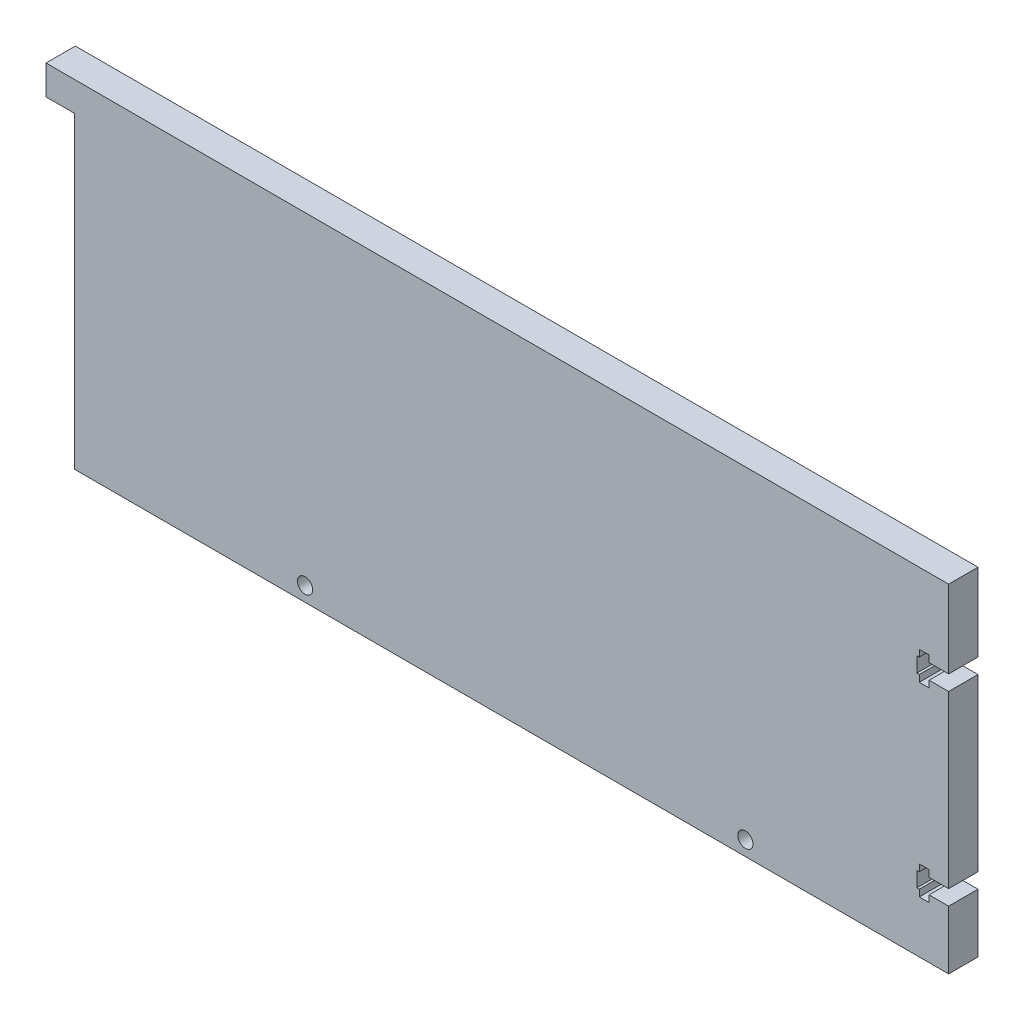
ISO-10303-21;
HEADER;
FILE_DESCRIPTION(('STEP AP214'),'2;1');
FILE_NAME('part.step','',(''),(''),'','','');
FILE_SCHEMA(('AUTOMOTIVE_DESIGN { 1 0 10303 214 1 1 1 1 }'));
ENDSEC;
DATA;
#1=APPLICATION_CONTEXT('core data for automotive mechanical design processes');
#2=APPLICATION_PROTOCOL_DEFINITION('international standard','automotive_design',2000,#1);
#3=PRODUCT_CONTEXT('',#1,'mechanical');
#4=PRODUCT('Part','Part','',(#3));
#5=PRODUCT_RELATED_PRODUCT_CATEGORY('part','',(#4));
#6=PRODUCT_DEFINITION_FORMATION('','',#4);
#7=PRODUCT_DEFINITION_CONTEXT('part definition',#1,'design');
#8=PRODUCT_DEFINITION('design','',#6,#7);
#9=PRODUCT_DEFINITION_SHAPE('','',#8);
#10=(LENGTH_UNIT() NAMED_UNIT(*) SI_UNIT(.MILLI.,.METRE.));
#11=(NAMED_UNIT(*) PLANE_ANGLE_UNIT() SI_UNIT($,.RADIAN.));
#12=(NAMED_UNIT(*) SI_UNIT($,.STERADIAN.) SOLID_ANGLE_UNIT());
#13=UNCERTAINTY_MEASURE_WITH_UNIT(LENGTH_MEASURE(1.E-05),#10,'distance_accuracy_value','');
#14=(GEOMETRIC_REPRESENTATION_CONTEXT(3) GLOBAL_UNCERTAINTY_ASSIGNED_CONTEXT((#13)) GLOBAL_UNIT_ASSIGNED_CONTEXT((#10,
#11,#12)) REPRESENTATION_CONTEXT('',''));
#15=CARTESIAN_POINT('',(0.,0.,0.));
#16=DIRECTION('',(0.,0.,1.));
#17=DIRECTION('',(1.,0.,0.));
#18=AXIS2_PLACEMENT_3D('',#15,#16,#17);
#19=CARTESIAN_POINT('',(172.7,107.594867693291,-6.));
#20=DIRECTION('',(1.,0.,0.));
#21=DIRECTION('',(0.,0.,-1.));
#22=AXIS2_PLACEMENT_3D('',#19,#20,#21);
#23=PLANE('',#22);
#24=DIRECTION('',(0.,0.,-1.));
#25=VECTOR('',#24,1.);
#26=CARTESIAN_POINT('',(172.7,88.5948676932912,0.));
#27=LINE('',#26,#25);
#28=CARTESIAN_POINT('',(172.7,88.5948676932912,0.));
#29=VERTEX_POINT('',#28);
#30=CARTESIAN_POINT('',(172.7,88.5948676932912,-6.));
#31=VERTEX_POINT('',#30);
#32=EDGE_CURVE('E314',#29,#31,#27,.T.);
#33=ORIENTED_EDGE('',*,*,#32,.F.);
#34=DIRECTION('',(0.,1.,0.));
#35=VECTOR('',#34,1.);
#36=CARTESIAN_POINT('',(172.7,107.594867693291,0.));
#37=LINE('',#36,#35);
#38=CARTESIAN_POINT('',(172.7,53.6948676932912,0.));
#39=VERTEX_POINT('',#38);
#40=EDGE_CURVE('E462',#39,#29,#37,.T.);
#41=ORIENTED_EDGE('',*,*,#40,.F.);
#42=DIRECTION('',(0.,0.,-1.));
#43=VECTOR('',#42,1.);
#44=CARTESIAN_POINT('',(172.7,53.6948676932912,0.));
#45=LINE('',#44,#43);
#46=CARTESIAN_POINT('',(172.7,53.6948676932912,-6.));
#47=VERTEX_POINT('',#46);
#48=EDGE_CURVE('E408',#39,#47,#45,.T.);
#49=ORIENTED_EDGE('',*,*,#48,.T.);
#50=DIRECTION('',(0.,1.,0.));
#51=VECTOR('',#50,1.);
#52=CARTESIAN_POINT('',(172.7,107.594867693291,-6.));
#53=LINE('',#52,#51);
#54=EDGE_CURVE('E451',#47,#31,#53,.T.);
#55=ORIENTED_EDGE('',*,*,#54,.T.);
#56=EDGE_LOOP('',(#33,#41,#49,#55));
#57=FACE_BOUND('',#56,.T.);
#58=ADVANCED_FACE('F34',(#57),#23,.T.);
#59=DIRECTION('',(0.,0.,-1.));
#60=VECTOR('',#59,1.);
#61=CARTESIAN_POINT('',(172.7,50.5948676932912,0.));
#62=LINE('',#61,#60);
#63=CARTESIAN_POINT('',(172.7,50.5948676932912,0.));
#64=VERTEX_POINT('',#63);
#65=CARTESIAN_POINT('',(172.7,50.5948676932912,-6.));
#66=VERTEX_POINT('',#65);
#67=EDGE_CURVE('E405',#64,#66,#62,.T.);
#68=ORIENTED_EDGE('',*,*,#67,.F.);
#69=CARTESIAN_POINT('',(172.7,38.5948676932912,0.));
#70=VERTEX_POINT('',#69);
#71=EDGE_CURVE('E242',#70,#64,#37,.T.);
#72=ORIENTED_EDGE('',*,*,#71,.F.);
#73=DIRECTION('',(0.,0.,1.));
#74=VECTOR('',#73,1.);
#75=CARTESIAN_POINT('',(172.7,38.5948676932912,-6.));
#76=LINE('',#75,#74);
#77=CARTESIAN_POINT('',(172.7,38.5948676932912,-6.));
#78=VERTEX_POINT('',#77);
#79=EDGE_CURVE('E43',#78,#70,#76,.T.);
#80=ORIENTED_EDGE('',*,*,#79,.F.);
#81=EDGE_CURVE('E447',#78,#66,#53,.T.);
#82=ORIENTED_EDGE('',*,*,#81,.T.);
#83=EDGE_LOOP('',(#68,#72,#80,#82));
#84=FACE_BOUND('',#83,.T.);
#85=ADVANCED_FACE('F478',(#84),#23,.T.);
#86=CARTESIAN_POINT('',(172.7,107.594867693291,-6.));
#87=DIRECTION('',(0.,1.,0.));
#88=DIRECTION('',(-1.,0.,0.));
#89=AXIS2_PLACEMENT_3D('',#86,#87,#88);
#90=PLANE('',#89);
#91=DIRECTION('',(-1.,0.,0.));
#92=VECTOR('',#91,1.);
#93=CARTESIAN_POINT('',(172.7,107.594867693291,0.));
#94=LINE('',#93,#92);
#95=CARTESIAN_POINT('',(172.7,107.594867693291,0.));
#96=VERTEX_POINT('',#95);
#97=CARTESIAN_POINT('',(-11.8,107.594867693291,0.));
#98=VERTEX_POINT('',#97);
#99=EDGE_CURVE('E439',#96,#98,#94,.T.);
#100=ORIENTED_EDGE('',*,*,#99,.F.);
#101=DIRECTION('',(0.,0.,1.));
#102=VECTOR('',#101,1.);
#103=CARTESIAN_POINT('',(172.7,107.594867693291,-6.));
#104=LINE('',#103,#102);
#105=CARTESIAN_POINT('',(172.7,107.594867693291,-6.));
#106=VERTEX_POINT('',#105);
#107=EDGE_CURVE('E11',#106,#96,#104,.T.);
#108=ORIENTED_EDGE('',*,*,#107,.F.);
#109=DIRECTION('',(-1.,0.,0.));
#110=VECTOR('',#109,1.);
#111=CARTESIAN_POINT('',(172.7,107.594867693291,-6.));
#112=LINE('',#111,#110);
#113=CARTESIAN_POINT('',(-11.8,107.594867693291,-6.));
#114=VERTEX_POINT('',#113);
#115=EDGE_CURVE('E234',#106,#114,#112,.T.);
#116=ORIENTED_EDGE('',*,*,#115,.T.);
#117=DIRECTION('',(0.,0.,-1.));
#118=VECTOR('',#117,1.);
#119=CARTESIAN_POINT('',(-11.8,107.594867693291,-6.));
#120=LINE('',#119,#118);
#121=EDGE_CURVE('E238',#98,#114,#120,.T.);
#122=ORIENTED_EDGE('',*,*,#121,.F.);
#123=EDGE_LOOP('',(#100,#108,#116,#122));
#124=FACE_BOUND('',#123,.T.);
#125=ADVANCED_FACE('F36',(#124),#90,.T.);
#126=DIRECTION('',(0.,0.,-1.));
#127=VECTOR('',#126,1.);
#128=CARTESIAN_POINT('',(172.7,91.6948676932912,0.));
#129=LINE('',#128,#127);
#130=CARTESIAN_POINT('',(172.7,91.6948676932912,0.));
#131=VERTEX_POINT('',#130);
#132=CARTESIAN_POINT('',(172.7,91.6948676932912,-6.));
#133=VERTEX_POINT('',#132);
#134=EDGE_CURVE('E317',#131,#133,#129,.T.);
#135=ORIENTED_EDGE('',*,*,#134,.T.);
#136=EDGE_CURVE('E446',#133,#106,#53,.T.);
#137=ORIENTED_EDGE('',*,*,#136,.T.);
#138=ORIENTED_EDGE('',*,*,#107,.T.);
#139=EDGE_CURVE('E463',#131,#96,#37,.T.);
#140=ORIENTED_EDGE('',*,*,#139,.F.);
#141=EDGE_LOOP('',(#135,#137,#138,#140));
#142=FACE_BOUND('',#141,.T.);
#143=ADVANCED_FACE('F562',(#142),#23,.T.);
#144=CARTESIAN_POINT('',(172.7,38.5948676932912,-6.));
#145=DIRECTION('',(0.,-1.,0.));
#146=DIRECTION('',(1.,0.,0.));
#147=AXIS2_PLACEMENT_3D('',#144,#145,#146);
#148=PLANE('',#147);
#149=DIRECTION('',(1.,0.,0.));
#150=VECTOR('',#149,1.);
#151=CARTESIAN_POINT('',(172.7,38.5948676932912,0.));
#152=LINE('',#151,#150);
#153=CARTESIAN_POINT('',(-5.99999999999998,38.5948676932912,0.));
#154=VERTEX_POINT('',#153);
#155=EDGE_CURVE('E456',#154,#70,#152,.T.);
#156=ORIENTED_EDGE('',*,*,#155,.F.);
#157=DIRECTION('',(0.,0.,1.));
#158=VECTOR('',#157,1.);
#159=CARTESIAN_POINT('',(-5.99999999999998,38.5948676932912,-6.));
#160=LINE('',#159,#158);
#161=CARTESIAN_POINT('',(-5.99999999999998,38.5948676932912,-6.));
#162=VERTEX_POINT('',#161);
#163=EDGE_CURVE('E450',#162,#154,#160,.T.);
#164=ORIENTED_EDGE('',*,*,#163,.F.);
#165=DIRECTION('',(1.,0.,0.));
#166=VECTOR('',#165,1.);
#167=CARTESIAN_POINT('',(172.7,38.5948676932912,-6.));
#168=LINE('',#167,#166);
#169=EDGE_CURVE('E443',#162,#78,#168,.T.);
#170=ORIENTED_EDGE('',*,*,#169,.T.);
#171=ORIENTED_EDGE('',*,*,#79,.T.);
#172=EDGE_LOOP('',(#156,#164,#170,#171));
#173=FACE_BOUND('',#172,.T.);
#174=ADVANCED_FACE('F583',(#173),#148,.T.);
#175=CARTESIAN_POINT('',(-5.99999999999998,107.594867693291,-6.));
#176=DIRECTION('',(-1.,0.,0.));
#177=DIRECTION('',(0.,0.,1.));
#178=AXIS2_PLACEMENT_3D('',#175,#176,#177);
#179=PLANE('',#178);
#180=DIRECTION('',(0.,0.,1.));
#181=VECTOR('',#180,1.);
#182=CARTESIAN_POINT('',(-5.99999999999998,101.594867693291,-6.));
#183=LINE('',#182,#181);
#184=CARTESIAN_POINT('',(-5.99999999999998,101.594867693291,-6.));
#185=VERTEX_POINT('',#184);
#186=CARTESIAN_POINT('',(-5.99999999999998,101.594867693291,0.));
#187=VERTEX_POINT('',#186);
#188=EDGE_CURVE('E51',#185,#187,#183,.T.);
#189=ORIENTED_EDGE('',*,*,#188,.F.);
#190=DIRECTION('',(0.,-1.,0.));
#191=VECTOR('',#190,1.);
#192=CARTESIAN_POINT('',(-5.99999999999998,107.594867693291,-6.));
#193=LINE('',#192,#191);
#194=EDGE_CURVE('E241',#185,#162,#193,.T.);
#195=ORIENTED_EDGE('',*,*,#194,.T.);
#196=ORIENTED_EDGE('',*,*,#163,.T.);
#197=DIRECTION('',(0.,-1.,0.));
#198=VECTOR('',#197,1.);
#199=CARTESIAN_POINT('',(-5.99999999999998,107.594867693291,0.));
#200=LINE('',#199,#198);
#201=EDGE_CURVE('E453',#187,#154,#200,.T.);
#202=ORIENTED_EDGE('',*,*,#201,.F.);
#203=EDGE_LOOP('',(#189,#195,#196,#202));
#204=FACE_BOUND('',#203,.T.);
#205=ADVANCED_FACE('F588',(#204),#179,.T.);
#206=CARTESIAN_POINT('',(0.,0.,-6.));
#207=DIRECTION('',(0.,0.,1.));
#208=DIRECTION('',(1.,0.,0.));
#209=AXIS2_PLACEMENT_3D('',#206,#207,#208);
#210=PLANE('',#209);
#211=CARTESIAN_POINT('',(131.15,41.5948676932912,-6.));
#212=DIRECTION('',(0.,0.,-1.));
#213=DIRECTION('',(-1.,0.,0.));
#214=AXIS2_PLACEMENT_3D('',#211,#212,#213);
#215=CIRCLE('',#214,1.54999999999999);
#216=CARTESIAN_POINT('',(129.6,41.5948676932912,-6.));
#217=VERTEX_POINT('',#216);
#218=EDGE_CURVE('E407',#217,#217,#215,.T.);
#219=ORIENTED_EDGE('',*,*,#218,.F.);
#220=EDGE_LOOP('',(#219));
#221=FACE_BOUND('',#220,.T.);
#222=CARTESIAN_POINT('',(41.15,41.5948676932912,-6.));
#223=DIRECTION('',(0.,0.,-1.));
#224=DIRECTION('',(-1.,0.,0.));
#225=AXIS2_PLACEMENT_3D('',#222,#223,#224);
#226=CIRCLE('',#225,1.55);
#227=CARTESIAN_POINT('',(39.6,41.5948676932912,-6.));
#228=VERTEX_POINT('',#227);
#229=EDGE_CURVE('E433',#228,#228,#226,.T.);
#230=ORIENTED_EDGE('',*,*,#229,.F.);
#231=EDGE_LOOP('',(#230));
#232=FACE_BOUND('',#231,.T.);
#233=DIRECTION('',(0.,-1.,0.));
#234=VECTOR('',#233,1.);
#235=CARTESIAN_POINT('',(168.7,87.2198676932912,-6.));
#236=LINE('',#235,#234);
#237=CARTESIAN_POINT('',(168.7,88.5948676932912,-6.));
#238=VERTEX_POINT('',#237);
#239=CARTESIAN_POINT('',(168.7,87.2198676932912,-6.));
#240=VERTEX_POINT('',#239);
#241=EDGE_CURVE('E278',#238,#240,#236,.T.);
#242=ORIENTED_EDGE('',*,*,#241,.F.);
#243=DIRECTION('',(-1.,0.,0.));
#244=VECTOR('',#243,1.);
#245=CARTESIAN_POINT('',(172.7,88.5948676932912,-6.));
#246=LINE('',#245,#244);
#247=EDGE_CURVE('E275',#31,#238,#246,.T.);
#248=ORIENTED_EDGE('',*,*,#247,.F.);
#249=ORIENTED_EDGE('',*,*,#54,.F.);
#250=DIRECTION('',(1.,0.,0.));
#251=VECTOR('',#250,1.);
#252=CARTESIAN_POINT('',(172.7,53.6948676932912,-6.));
#253=LINE('',#252,#251);
#254=CARTESIAN_POINT('',(168.7,53.6948676932912,-6.));
#255=VERTEX_POINT('',#254);
#256=EDGE_CURVE('E344',#255,#47,#253,.T.);
#257=ORIENTED_EDGE('',*,*,#256,.F.);
#258=DIRECTION('',(0.,-1.,0.));
#259=VECTOR('',#258,1.);
#260=CARTESIAN_POINT('',(168.7,53.6948676932912,-6.));
#261=LINE('',#260,#259);
#262=CARTESIAN_POINT('',(168.7,55.0698676932912,-6.));
#263=VERTEX_POINT('',#262);
#264=EDGE_CURVE('E401',#263,#255,#261,.T.);
#265=ORIENTED_EDGE('',*,*,#264,.F.);
#266=DIRECTION('',(1.,0.,0.));
#267=VECTOR('',#266,1.);
#268=CARTESIAN_POINT('',(168.7,55.0698676932912,-6.));
#269=LINE('',#268,#267);
#270=CARTESIAN_POINT('',(166.7,55.0698676932912,-6.));
#271=VERTEX_POINT('',#270);
#272=EDGE_CURVE('E398',#271,#263,#269,.T.);
#273=ORIENTED_EDGE('',*,*,#272,.F.);
#274=DIRECTION('',(0.,1.,0.));
#275=VECTOR('',#274,1.);
#276=CARTESIAN_POINT('',(166.7,53.6948676932912,-6.));
#277=LINE('',#276,#275);
#278=CARTESIAN_POINT('',(166.7,53.6948676932912,-6.));
#279=VERTEX_POINT('',#278);
#280=EDGE_CURVE('E395',#279,#271,#277,.T.);
#281=ORIENTED_EDGE('',*,*,#280,.F.);
#282=DIRECTION('',(1.,0.,0.));
#283=VECTOR('',#282,1.);
#284=CARTESIAN_POINT('',(166.7,53.6948676932912,-6.));
#285=LINE('',#284,#283);
#286=CARTESIAN_POINT('',(166.2,53.6948676932912,-6.));
#287=VERTEX_POINT('',#286);
#288=EDGE_CURVE('E392',#287,#279,#285,.T.);
#289=ORIENTED_EDGE('',*,*,#288,.F.);
#290=DIRECTION('',(0.,1.,0.));
#291=VECTOR('',#290,1.);
#292=CARTESIAN_POINT('',(166.2,50.5948676932912,-6.));
#293=LINE('',#292,#291);
#294=CARTESIAN_POINT('',(166.2,50.5948676932912,-6.));
#295=VERTEX_POINT('',#294);
#296=EDGE_CURVE('E389',#295,#287,#293,.T.);
#297=ORIENTED_EDGE('',*,*,#296,.F.);
#298=DIRECTION('',(-1.,0.,0.));
#299=VECTOR('',#298,1.);
#300=CARTESIAN_POINT('',(166.7,50.5948676932912,-6.));
#301=LINE('',#300,#299);
#302=CARTESIAN_POINT('',(166.7,50.5948676932912,-6.));
#303=VERTEX_POINT('',#302);
#304=EDGE_CURVE('E386',#303,#295,#301,.T.);
#305=ORIENTED_EDGE('',*,*,#304,.F.);
#306=DIRECTION('',(0.,1.,0.));
#307=VECTOR('',#306,1.);
#308=CARTESIAN_POINT('',(166.7,49.2198676932912,-6.));
#309=LINE('',#308,#307);
#310=CARTESIAN_POINT('',(166.7,49.2198676932912,-6.));
#311=VERTEX_POINT('',#310);
#312=EDGE_CURVE('E383',#311,#303,#309,.T.);
#313=ORIENTED_EDGE('',*,*,#312,.F.);
#314=DIRECTION('',(-1.,0.,0.));
#315=VECTOR('',#314,1.);
#316=CARTESIAN_POINT('',(168.7,49.2198676932912,-6.));
#317=LINE('',#316,#315);
#318=CARTESIAN_POINT('',(168.7,49.2198676932912,-6.));
#319=VERTEX_POINT('',#318);
#320=EDGE_CURVE('E380',#319,#311,#317,.T.);
#321=ORIENTED_EDGE('',*,*,#320,.F.);
#322=DIRECTION('',(0.,-1.,0.));
#323=VECTOR('',#322,1.);
#324=CARTESIAN_POINT('',(168.7,49.2198676932912,-6.));
#325=LINE('',#324,#323);
#326=CARTESIAN_POINT('',(168.7,50.5948676932912,-6.));
#327=VERTEX_POINT('',#326);
#328=EDGE_CURVE('E377',#327,#319,#325,.T.);
#329=ORIENTED_EDGE('',*,*,#328,.F.);
#330=DIRECTION('',(-1.,0.,0.));
#331=VECTOR('',#330,1.);
#332=CARTESIAN_POINT('',(172.7,50.5948676932912,-6.));
#333=LINE('',#332,#331);
#334=EDGE_CURVE('E316',#66,#327,#333,.T.);
#335=ORIENTED_EDGE('',*,*,#334,.F.);
#336=ORIENTED_EDGE('',*,*,#81,.F.);
#337=ORIENTED_EDGE('',*,*,#169,.F.);
#338=ORIENTED_EDGE('',*,*,#194,.F.);
#339=DIRECTION('',(1.,0.,0.));
#340=VECTOR('',#339,1.);
#341=CARTESIAN_POINT('',(-11.8,101.594867693291,-6.));
#342=LINE('',#341,#340);
#343=CARTESIAN_POINT('',(-11.8,101.594867693291,-6.));
#344=VERTEX_POINT('',#343);
#345=EDGE_CURVE('E249',#344,#185,#342,.T.);
#346=ORIENTED_EDGE('',*,*,#345,.F.);
#347=DIRECTION('',(0.,-1.,0.));
#348=VECTOR('',#347,1.);
#349=CARTESIAN_POINT('',(-11.8,107.594867693291,-6.));
#350=LINE('',#349,#348);
#351=EDGE_CURVE('E245',#114,#344,#350,.T.);
#352=ORIENTED_EDGE('',*,*,#351,.F.);
#353=ORIENTED_EDGE('',*,*,#115,.F.);
#354=ORIENTED_EDGE('',*,*,#136,.F.);
#355=DIRECTION('',(1.,0.,0.));
#356=VECTOR('',#355,1.);
#357=CARTESIAN_POINT('',(172.7,91.6948676932912,-6.));
#358=LINE('',#357,#356);
#359=CARTESIAN_POINT('',(168.7,91.6948676932912,-6.));
#360=VERTEX_POINT('',#359);
#361=EDGE_CURVE('E312',#360,#133,#358,.T.);
#362=ORIENTED_EDGE('',*,*,#361,.F.);
#363=DIRECTION('',(0.,-1.,0.));
#364=VECTOR('',#363,1.);
#365=CARTESIAN_POINT('',(168.7,91.6948676932912,-6.));
#366=LINE('',#365,#364);
#367=CARTESIAN_POINT('',(168.7,93.0698676932912,-6.));
#368=VERTEX_POINT('',#367);
#369=EDGE_CURVE('E309',#368,#360,#366,.T.);
#370=ORIENTED_EDGE('',*,*,#369,.F.);
#371=DIRECTION('',(1.,0.,0.));
#372=VECTOR('',#371,1.);
#373=CARTESIAN_POINT('',(168.7,93.0698676932912,-6.));
#374=LINE('',#373,#372);
#375=CARTESIAN_POINT('',(166.7,93.0698676932912,-6.));
#376=VERTEX_POINT('',#375);
#377=EDGE_CURVE('E306',#376,#368,#374,.T.);
#378=ORIENTED_EDGE('',*,*,#377,.F.);
#379=DIRECTION('',(0.,1.,0.));
#380=VECTOR('',#379,1.);
#381=CARTESIAN_POINT('',(166.7,91.6948676932912,-6.));
#382=LINE('',#381,#380);
#383=CARTESIAN_POINT('',(166.7,91.6948676932912,-6.));
#384=VERTEX_POINT('',#383);
#385=EDGE_CURVE('E303',#384,#376,#382,.T.);
#386=ORIENTED_EDGE('',*,*,#385,.F.);
#387=DIRECTION('',(1.,0.,0.));
#388=VECTOR('',#387,1.);
#389=CARTESIAN_POINT('',(166.7,91.6948676932912,-6.));
#390=LINE('',#389,#388);
#391=CARTESIAN_POINT('',(166.2,91.6948676932912,-6.));
#392=VERTEX_POINT('',#391);
#393=EDGE_CURVE('E300',#392,#384,#390,.T.);
#394=ORIENTED_EDGE('',*,*,#393,.F.);
#395=DIRECTION('',(0.,1.,0.));
#396=VECTOR('',#395,1.);
#397=CARTESIAN_POINT('',(166.2,88.5948676932912,-6.));
#398=LINE('',#397,#396);
#399=CARTESIAN_POINT('',(166.2,88.5948676932912,-6.));
#400=VERTEX_POINT('',#399);
#401=EDGE_CURVE('E297',#400,#392,#398,.T.);
#402=ORIENTED_EDGE('',*,*,#401,.F.);
#403=DIRECTION('',(-1.,0.,0.));
#404=VECTOR('',#403,1.);
#405=CARTESIAN_POINT('',(166.7,88.5948676932912,-6.));
#406=LINE('',#405,#404);
#407=CARTESIAN_POINT('',(166.7,88.5948676932912,-6.));
#408=VERTEX_POINT('',#407);
#409=EDGE_CURVE('E294',#408,#400,#406,.T.);
#410=ORIENTED_EDGE('',*,*,#409,.F.);
#411=DIRECTION('',(0.,1.,0.));
#412=VECTOR('',#411,1.);
#413=CARTESIAN_POINT('',(166.7,87.2198676932912,-6.));
#414=LINE('',#413,#412);
#415=CARTESIAN_POINT('',(166.7,87.2198676932912,-6.));
#416=VERTEX_POINT('',#415);
#417=EDGE_CURVE('E291',#416,#408,#414,.T.);
#418=ORIENTED_EDGE('',*,*,#417,.F.);
#419=DIRECTION('',(-1.,0.,0.));
#420=VECTOR('',#419,1.);
#421=CARTESIAN_POINT('',(168.7,87.2198676932912,-6.));
#422=LINE('',#421,#420);
#423=EDGE_CURVE('E283',#240,#416,#422,.T.);
#424=ORIENTED_EDGE('',*,*,#423,.F.);
#425=EDGE_LOOP('',(#242,#248,#249,#257,#265,#273,#281,#289,#297,#305,#313,#321,#329,#335,#336,
#337,#338,#346,#352,#353,#354,#362,#370,#378,#386,#394,#402,#410,#418,#424));
#426=FACE_BOUND('',#425,.T.);
#427=ADVANCED_FACE('F247',(#221,#232,#426),#210,.F.);
#428=CARTESIAN_POINT('',(0.,0.,0.));
#429=DIRECTION('',(0.,0.,1.));
#430=DIRECTION('',(1.,0.,0.));
#431=AXIS2_PLACEMENT_3D('',#428,#429,#430);
#432=PLANE('',#431);
#433=DIRECTION('',(-1.,0.,0.));
#434=VECTOR('',#433,1.);
#435=CARTESIAN_POINT('',(172.7,88.5948676932912,0.));
#436=LINE('',#435,#434);
#437=CARTESIAN_POINT('',(168.7,88.5948676932912,0.));
#438=VERTEX_POINT('',#437);
#439=EDGE_CURVE('E266',#29,#438,#436,.T.);
#440=ORIENTED_EDGE('',*,*,#439,.T.);
#441=DIRECTION('',(0.,-1.,0.));
#442=VECTOR('',#441,1.);
#443=CARTESIAN_POINT('',(168.7,87.2198676932912,0.));
#444=LINE('',#443,#442);
#445=CARTESIAN_POINT('',(168.7,87.2198676932912,0.));
#446=VERTEX_POINT('',#445);
#447=EDGE_CURVE('E536',#438,#446,#444,.T.);
#448=ORIENTED_EDGE('',*,*,#447,.T.);
#449=DIRECTION('',(-1.,0.,0.));
#450=VECTOR('',#449,1.);
#451=CARTESIAN_POINT('',(168.7,87.2198676932912,0.));
#452=LINE('',#451,#450);
#453=CARTESIAN_POINT('',(166.7,87.2198676932912,0.));
#454=VERTEX_POINT('',#453);
#455=EDGE_CURVE('E59',#446,#454,#452,.T.);
#456=ORIENTED_EDGE('',*,*,#455,.T.);
#457=DIRECTION('',(0.,1.,0.));
#458=VECTOR('',#457,1.);
#459=CARTESIAN_POINT('',(166.7,87.2198676932912,0.));
#460=LINE('',#459,#458);
#461=CARTESIAN_POINT('',(166.7,88.5948676932912,0.));
#462=VERTEX_POINT('',#461);
#463=EDGE_CURVE('E537',#454,#462,#460,.T.);
#464=ORIENTED_EDGE('',*,*,#463,.T.);
#465=DIRECTION('',(-1.,0.,0.));
#466=VECTOR('',#465,1.);
#467=CARTESIAN_POINT('',(166.7,88.5948676932912,0.));
#468=LINE('',#467,#466);
#469=CARTESIAN_POINT('',(166.2,88.5948676932912,0.));
#470=VERTEX_POINT('',#469);
#471=EDGE_CURVE('E542',#462,#470,#468,.T.);
#472=ORIENTED_EDGE('',*,*,#471,.T.);
#473=DIRECTION('',(0.,1.,0.));
#474=VECTOR('',#473,1.);
#475=CARTESIAN_POINT('',(166.2,88.5948676932912,0.));
#476=LINE('',#475,#474);
#477=CARTESIAN_POINT('',(166.2,91.6948676932912,0.));
#478=VERTEX_POINT('',#477);
#479=EDGE_CURVE('E545',#470,#478,#476,.T.);
#480=ORIENTED_EDGE('',*,*,#479,.T.);
#481=DIRECTION('',(1.,0.,0.));
#482=VECTOR('',#481,1.);
#483=CARTESIAN_POINT('',(166.7,91.6948676932912,0.));
#484=LINE('',#483,#482);
#485=CARTESIAN_POINT('',(166.7,91.6948676932912,0.));
#486=VERTEX_POINT('',#485);
#487=EDGE_CURVE('E548',#478,#486,#484,.T.);
#488=ORIENTED_EDGE('',*,*,#487,.T.);
#489=DIRECTION('',(0.,1.,0.));
#490=VECTOR('',#489,1.);
#491=CARTESIAN_POINT('',(166.7,91.6948676932912,0.));
#492=LINE('',#491,#490);
#493=CARTESIAN_POINT('',(166.7,93.0698676932912,0.));
#494=VERTEX_POINT('',#493);
#495=EDGE_CURVE('E551',#486,#494,#492,.T.);
#496=ORIENTED_EDGE('',*,*,#495,.T.);
#497=DIRECTION('',(1.,0.,0.));
#498=VECTOR('',#497,1.);
#499=CARTESIAN_POINT('',(168.7,93.0698676932912,0.));
#500=LINE('',#499,#498);
#501=CARTESIAN_POINT('',(168.7,93.0698676932912,0.));
#502=VERTEX_POINT('',#501);
#503=EDGE_CURVE('E554',#494,#502,#500,.T.);
#504=ORIENTED_EDGE('',*,*,#503,.T.);
#505=DIRECTION('',(0.,-1.,0.));
#506=VECTOR('',#505,1.);
#507=CARTESIAN_POINT('',(168.7,91.6948676932912,0.));
#508=LINE('',#507,#506);
#509=CARTESIAN_POINT('',(168.7,91.6948676932912,0.));
#510=VERTEX_POINT('',#509);
#511=EDGE_CURVE('E556',#502,#510,#508,.T.);
#512=ORIENTED_EDGE('',*,*,#511,.T.);
#513=DIRECTION('',(1.,0.,0.));
#514=VECTOR('',#513,1.);
#515=CARTESIAN_POINT('',(172.7,91.6948676932912,0.));
#516=LINE('',#515,#514);
#517=EDGE_CURVE('E286',#510,#131,#516,.T.);
#518=ORIENTED_EDGE('',*,*,#517,.T.);
#519=ORIENTED_EDGE('',*,*,#139,.T.);
#520=ORIENTED_EDGE('',*,*,#99,.T.);
#521=DIRECTION('',(0.,1.,0.));
#522=VECTOR('',#521,1.);
#523=CARTESIAN_POINT('',(-11.8,107.594867693291,0.));
#524=LINE('',#523,#522);
#525=CARTESIAN_POINT('',(-11.8,101.594867693291,0.));
#526=VERTEX_POINT('',#525);
#527=EDGE_CURVE('E257',#526,#98,#524,.T.);
#528=ORIENTED_EDGE('',*,*,#527,.F.);
#529=DIRECTION('',(1.,0.,0.));
#530=VECTOR('',#529,1.);
#531=CARTESIAN_POINT('',(-11.8,101.594867693291,0.));
#532=LINE('',#531,#530);
#533=EDGE_CURVE('E263',#526,#187,#532,.T.);
#534=ORIENTED_EDGE('',*,*,#533,.T.);
#535=ORIENTED_EDGE('',*,*,#201,.T.);
#536=ORIENTED_EDGE('',*,*,#155,.T.);
#537=ORIENTED_EDGE('',*,*,#71,.T.);
#538=DIRECTION('',(-1.,0.,0.));
#539=VECTOR('',#538,1.);
#540=CARTESIAN_POINT('',(172.7,50.5948676932912,0.));
#541=LINE('',#540,#539);
#542=CARTESIAN_POINT('',(168.7,50.5948676932912,0.));
#543=VERTEX_POINT('',#542);
#544=EDGE_CURVE('E340',#64,#543,#541,.T.);
#545=ORIENTED_EDGE('',*,*,#544,.T.);
#546=DIRECTION('',(0.,-1.,0.));
#547=VECTOR('',#546,1.);
#548=CARTESIAN_POINT('',(168.7,49.2198676932912,0.));
#549=LINE('',#548,#547);
#550=CARTESIAN_POINT('',(168.7,49.2198676932912,0.));
#551=VERTEX_POINT('',#550);
#552=EDGE_CURVE('E343',#543,#551,#549,.T.);
#553=ORIENTED_EDGE('',*,*,#552,.T.);
#554=DIRECTION('',(-1.,0.,0.));
#555=VECTOR('',#554,1.);
#556=CARTESIAN_POINT('',(168.7,49.2198676932912,0.));
#557=LINE('',#556,#555);
#558=CARTESIAN_POINT('',(166.7,49.2198676932912,0.));
#559=VERTEX_POINT('',#558);
#560=EDGE_CURVE('E347',#551,#559,#557,.T.);
#561=ORIENTED_EDGE('',*,*,#560,.T.);
#562=DIRECTION('',(0.,1.,0.));
#563=VECTOR('',#562,1.);
#564=CARTESIAN_POINT('',(166.7,49.2198676932912,0.));
#565=LINE('',#564,#563);
#566=CARTESIAN_POINT('',(166.7,50.5948676932912,0.));
#567=VERTEX_POINT('',#566);
#568=EDGE_CURVE('E350',#559,#567,#565,.T.);
#569=ORIENTED_EDGE('',*,*,#568,.T.);
#570=DIRECTION('',(-1.,0.,0.));
#571=VECTOR('',#570,1.);
#572=CARTESIAN_POINT('',(166.7,50.5948676932912,0.));
#573=LINE('',#572,#571);
#574=CARTESIAN_POINT('',(166.2,50.5948676932912,0.));
#575=VERTEX_POINT('',#574);
#576=EDGE_CURVE('E353',#567,#575,#573,.T.);
#577=ORIENTED_EDGE('',*,*,#576,.T.);
#578=DIRECTION('',(0.,1.,0.));
#579=VECTOR('',#578,1.);
#580=CARTESIAN_POINT('',(166.2,50.5948676932912,0.));
#581=LINE('',#580,#579);
#582=CARTESIAN_POINT('',(166.2,53.6948676932912,0.));
#583=VERTEX_POINT('',#582);
#584=EDGE_CURVE('E356',#575,#583,#581,.T.);
#585=ORIENTED_EDGE('',*,*,#584,.T.);
#586=DIRECTION('',(1.,0.,0.));
#587=VECTOR('',#586,1.);
#588=CARTESIAN_POINT('',(166.7,53.6948676932912,0.));
#589=LINE('',#588,#587);
#590=CARTESIAN_POINT('',(166.7,53.6948676932912,0.));
#591=VERTEX_POINT('',#590);
#592=EDGE_CURVE('E359',#583,#591,#589,.T.);
#593=ORIENTED_EDGE('',*,*,#592,.T.);
#594=DIRECTION('',(0.,1.,0.));
#595=VECTOR('',#594,1.);
#596=CARTESIAN_POINT('',(166.7,53.6948676932912,0.));
#597=LINE('',#596,#595);
#598=CARTESIAN_POINT('',(166.7,55.0698676932912,0.));
#599=VERTEX_POINT('',#598);
#600=EDGE_CURVE('E362',#591,#599,#597,.T.);
#601=ORIENTED_EDGE('',*,*,#600,.T.);
#602=DIRECTION('',(1.,0.,0.));
#603=VECTOR('',#602,1.);
#604=CARTESIAN_POINT('',(168.7,55.0698676932912,0.));
#605=LINE('',#604,#603);
#606=CARTESIAN_POINT('',(168.7,55.0698676932912,0.));
#607=VERTEX_POINT('',#606);
#608=EDGE_CURVE('E365',#599,#607,#605,.T.);
#609=ORIENTED_EDGE('',*,*,#608,.T.);
#610=DIRECTION('',(0.,-1.,0.));
#611=VECTOR('',#610,1.);
#612=CARTESIAN_POINT('',(168.7,53.6948676932912,0.));
#613=LINE('',#612,#611);
#614=CARTESIAN_POINT('',(168.7,53.6948676932912,0.));
#615=VERTEX_POINT('',#614);
#616=EDGE_CURVE('E368',#607,#615,#613,.T.);
#617=ORIENTED_EDGE('',*,*,#616,.T.);
#618=DIRECTION('',(1.,0.,0.));
#619=VECTOR('',#618,1.);
#620=CARTESIAN_POINT('',(172.7,53.6948676932912,0.));
#621=LINE('',#620,#619);
#622=EDGE_CURVE('E371',#615,#39,#621,.T.);
#623=ORIENTED_EDGE('',*,*,#622,.T.);
#624=ORIENTED_EDGE('',*,*,#40,.T.);
#625=EDGE_LOOP('',(#440,#448,#456,#464,#472,#480,#488,#496,#504,#512,#518,#519,#520,#528,#534,
#535,#536,#537,#545,#553,#561,#569,#577,#585,#593,#601,#609,#617,#623,#624));
#626=FACE_BOUND('',#625,.T.);
#627=CARTESIAN_POINT('',(131.15,41.5948676932912,0.));
#628=DIRECTION('',(0.,0.,-1.));
#629=DIRECTION('',(-1.,0.,0.));
#630=AXIS2_PLACEMENT_3D('',#627,#628,#629);
#631=CIRCLE('',#630,1.54999999999999);
#632=CARTESIAN_POINT('',(129.6,41.5948676932912,0.));
#633=VERTEX_POINT('',#632);
#634=EDGE_CURVE('E430',#633,#633,#631,.T.);
#635=ORIENTED_EDGE('',*,*,#634,.T.);
#636=EDGE_LOOP('',(#635));
#637=FACE_BOUND('',#636,.T.);
#638=CARTESIAN_POINT('',(41.15,41.5948676932912,0.));
#639=DIRECTION('',(0.,0.,-1.));
#640=DIRECTION('',(-1.,0.,0.));
#641=AXIS2_PLACEMENT_3D('',#638,#639,#640);
#642=CIRCLE('',#641,1.55);
#643=CARTESIAN_POINT('',(39.6,41.5948676932912,0.));
#644=VERTEX_POINT('',#643);
#645=EDGE_CURVE('E436',#644,#644,#642,.T.);
#646=ORIENTED_EDGE('',*,*,#645,.T.);
#647=EDGE_LOOP('',(#646));
#648=FACE_BOUND('',#647,.T.);
#649=ADVANCED_FACE('F472',(#626,#637,#648),#432,.T.);
#650=CARTESIAN_POINT('',(41.15,41.5948676932912,0.));
#651=DIRECTION('',(0.,0.,-1.));
#652=DIRECTION('',(-1.,0.,0.));
#653=AXIS2_PLACEMENT_3D('',#650,#651,#652);
#654=CYLINDRICAL_SURFACE('',#653,1.55);
#655=ORIENTED_EDGE('',*,*,#645,.F.);
#656=EDGE_LOOP('',(#655));
#657=FACE_BOUND('',#656,.T.);
#658=ORIENTED_EDGE('',*,*,#229,.T.);
#659=EDGE_LOOP('',(#658));
#660=FACE_BOUND('',#659,.T.);
#661=ADVANCED_FACE('F827',(#657,#660),#654,.F.);
#662=CARTESIAN_POINT('',(131.15,41.5948676932912,0.));
#663=DIRECTION('',(0.,0.,-1.));
#664=DIRECTION('',(-1.,0.,0.));
#665=AXIS2_PLACEMENT_3D('',#662,#663,#664);
#666=CYLINDRICAL_SURFACE('',#665,1.54999999999999);
#667=ORIENTED_EDGE('',*,*,#634,.F.);
#668=EDGE_LOOP('',(#667));
#669=FACE_BOUND('',#668,.T.);
#670=ORIENTED_EDGE('',*,*,#218,.T.);
#671=EDGE_LOOP('',(#670));
#672=FACE_BOUND('',#671,.T.);
#673=ADVANCED_FACE('F605',(#669,#672),#666,.F.);
#674=CARTESIAN_POINT('',(172.7,50.5948676932912,0.));
#675=DIRECTION('',(0.,-1.,0.));
#676=DIRECTION('',(0.,0.,-1.));
#677=AXIS2_PLACEMENT_3D('',#674,#675,#676);
#678=PLANE('',#677);
#679=ORIENTED_EDGE('',*,*,#334,.T.);
#680=DIRECTION('',(0.,0.,-1.));
#681=VECTOR('',#680,1.);
#682=CARTESIAN_POINT('',(168.7,50.5948676932912,0.));
#683=LINE('',#682,#681);
#684=EDGE_CURVE('E374',#543,#327,#683,.T.);
#685=ORIENTED_EDGE('',*,*,#684,.F.);
#686=ORIENTED_EDGE('',*,*,#544,.F.);
#687=ORIENTED_EDGE('',*,*,#67,.T.);
#688=EDGE_LOOP('',(#679,#685,#686,#687));
#689=FACE_BOUND('',#688,.T.);
#690=ADVANCED_FACE('F482',(#689),#678,.F.);
#691=CARTESIAN_POINT('',(172.7,53.6948676932912,0.));
#692=DIRECTION('',(0.,1.,0.));
#693=DIRECTION('',(-1.,0.,0.));
#694=AXIS2_PLACEMENT_3D('',#691,#692,#693);
#695=PLANE('',#694);
#696=ORIENTED_EDGE('',*,*,#256,.T.);
#697=ORIENTED_EDGE('',*,*,#48,.F.);
#698=ORIENTED_EDGE('',*,*,#622,.F.);
#699=DIRECTION('',(0.,0.,-1.));
#700=VECTOR('',#699,1.);
#701=CARTESIAN_POINT('',(168.7,53.6948676932912,0.));
#702=LINE('',#701,#700);
#703=EDGE_CURVE('E411',#615,#255,#702,.T.);
#704=ORIENTED_EDGE('',*,*,#703,.T.);
#705=EDGE_LOOP('',(#696,#697,#698,#704));
#706=FACE_BOUND('',#705,.T.);
#707=ADVANCED_FACE('F523',(#706),#695,.F.);
#708=CARTESIAN_POINT('',(168.7,53.6948676932912,0.));
#709=DIRECTION('',(1.,0.,0.));
#710=DIRECTION('',(0.,0.,-1.));
#711=AXIS2_PLACEMENT_3D('',#708,#709,#710);
#712=PLANE('',#711);
#713=ORIENTED_EDGE('',*,*,#264,.T.);
#714=ORIENTED_EDGE('',*,*,#703,.F.);
#715=ORIENTED_EDGE('',*,*,#616,.F.);
#716=DIRECTION('',(0.,0.,-1.));
#717=VECTOR('',#716,1.);
#718=CARTESIAN_POINT('',(168.7,55.0698676932912,0.));
#719=LINE('',#718,#717);
#720=EDGE_CURVE('E413',#607,#263,#719,.T.);
#721=ORIENTED_EDGE('',*,*,#720,.T.);
#722=EDGE_LOOP('',(#713,#714,#715,#721));
#723=FACE_BOUND('',#722,.T.);
#724=ADVANCED_FACE('F519',(#723),#712,.F.);
#725=CARTESIAN_POINT('',(168.7,55.0698676932912,0.));
#726=DIRECTION('',(0.,1.,0.));
#727=DIRECTION('',(0.,0.,1.));
#728=AXIS2_PLACEMENT_3D('',#725,#726,#727);
#729=PLANE('',#728);
#730=ORIENTED_EDGE('',*,*,#272,.T.);
#731=ORIENTED_EDGE('',*,*,#720,.F.);
#732=ORIENTED_EDGE('',*,*,#608,.F.);
#733=DIRECTION('',(0.,0.,-1.));
#734=VECTOR('',#733,1.);
#735=CARTESIAN_POINT('',(166.7,55.0698676932912,0.));
#736=LINE('',#735,#734);
#737=EDGE_CURVE('E415',#599,#271,#736,.T.);
#738=ORIENTED_EDGE('',*,*,#737,.T.);
#739=EDGE_LOOP('',(#730,#731,#732,#738));
#740=FACE_BOUND('',#739,.T.);
#741=ADVANCED_FACE('F515',(#740),#729,.F.);
#742=CARTESIAN_POINT('',(166.7,53.6948676932912,0.));
#743=DIRECTION('',(-1.,0.,0.));
#744=DIRECTION('',(0.,0.,1.));
#745=AXIS2_PLACEMENT_3D('',#742,#743,#744);
#746=PLANE('',#745);
#747=ORIENTED_EDGE('',*,*,#280,.T.);
#748=ORIENTED_EDGE('',*,*,#737,.F.);
#749=ORIENTED_EDGE('',*,*,#600,.F.);
#750=DIRECTION('',(0.,0.,-1.));
#751=VECTOR('',#750,1.);
#752=CARTESIAN_POINT('',(166.7,53.6948676932912,0.));
#753=LINE('',#752,#751);
#754=EDGE_CURVE('E417',#591,#279,#753,.T.);
#755=ORIENTED_EDGE('',*,*,#754,.T.);
#756=EDGE_LOOP('',(#747,#748,#749,#755));
#757=FACE_BOUND('',#756,.T.);
#758=ADVANCED_FACE('F511',(#757),#746,.F.);
#759=CARTESIAN_POINT('',(166.7,53.6948676932912,0.));
#760=DIRECTION('',(0.,1.,0.));
#761=DIRECTION('',(0.,0.,1.));
#762=AXIS2_PLACEMENT_3D('',#759,#760,#761);
#763=PLANE('',#762);
#764=ORIENTED_EDGE('',*,*,#288,.T.);
#765=ORIENTED_EDGE('',*,*,#754,.F.);
#766=ORIENTED_EDGE('',*,*,#592,.F.);
#767=DIRECTION('',(0.,0.,-1.));
#768=VECTOR('',#767,1.);
#769=CARTESIAN_POINT('',(166.2,53.6948676932912,0.));
#770=LINE('',#769,#768);
#771=EDGE_CURVE('E419',#583,#287,#770,.T.);
#772=ORIENTED_EDGE('',*,*,#771,.T.);
#773=EDGE_LOOP('',(#764,#765,#766,#772));
#774=FACE_BOUND('',#773,.T.);
#775=ADVANCED_FACE('F507',(#774),#763,.F.);
#776=CARTESIAN_POINT('',(166.2,50.5948676932912,0.));
#777=DIRECTION('',(-1.,0.,0.));
#778=DIRECTION('',(0.,0.,1.));
#779=AXIS2_PLACEMENT_3D('',#776,#777,#778);
#780=PLANE('',#779);
#781=ORIENTED_EDGE('',*,*,#296,.T.);
#782=ORIENTED_EDGE('',*,*,#771,.F.);
#783=ORIENTED_EDGE('',*,*,#584,.F.);
#784=DIRECTION('',(0.,0.,-1.));
#785=VECTOR('',#784,1.);
#786=CARTESIAN_POINT('',(166.2,50.5948676932912,0.));
#787=LINE('',#786,#785);
#788=EDGE_CURVE('E421',#575,#295,#787,.T.);
#789=ORIENTED_EDGE('',*,*,#788,.T.);
#790=EDGE_LOOP('',(#781,#782,#783,#789));
#791=FACE_BOUND('',#790,.T.);
#792=ADVANCED_FACE('F503',(#791),#780,.F.);
#793=CARTESIAN_POINT('',(166.7,50.5948676932912,0.));
#794=DIRECTION('',(0.,-1.,0.));
#795=DIRECTION('',(0.,0.,-1.));
#796=AXIS2_PLACEMENT_3D('',#793,#794,#795);
#797=PLANE('',#796);
#798=ORIENTED_EDGE('',*,*,#304,.T.);
#799=ORIENTED_EDGE('',*,*,#788,.F.);
#800=ORIENTED_EDGE('',*,*,#576,.F.);
#801=DIRECTION('',(0.,0.,-1.));
#802=VECTOR('',#801,1.);
#803=CARTESIAN_POINT('',(166.7,50.5948676932912,0.));
#804=LINE('',#803,#802);
#805=EDGE_CURVE('E423',#567,#303,#804,.T.);
#806=ORIENTED_EDGE('',*,*,#805,.T.);
#807=EDGE_LOOP('',(#798,#799,#800,#806));
#808=FACE_BOUND('',#807,.T.);
#809=ADVANCED_FACE('F499',(#808),#797,.F.);
#810=CARTESIAN_POINT('',(166.7,49.2198676932912,0.));
#811=DIRECTION('',(-1.,0.,0.));
#812=DIRECTION('',(0.,0.,1.));
#813=AXIS2_PLACEMENT_3D('',#810,#811,#812);
#814=PLANE('',#813);
#815=ORIENTED_EDGE('',*,*,#312,.T.);
#816=ORIENTED_EDGE('',*,*,#805,.F.);
#817=ORIENTED_EDGE('',*,*,#568,.F.);
#818=DIRECTION('',(0.,0.,-1.));
#819=VECTOR('',#818,1.);
#820=CARTESIAN_POINT('',(166.7,49.2198676932912,0.));
#821=LINE('',#820,#819);
#822=EDGE_CURVE('E425',#559,#311,#821,.T.);
#823=ORIENTED_EDGE('',*,*,#822,.T.);
#824=EDGE_LOOP('',(#815,#816,#817,#823));
#825=FACE_BOUND('',#824,.T.);
#826=ADVANCED_FACE('F495',(#825),#814,.F.);
#827=CARTESIAN_POINT('',(168.7,49.2198676932912,0.));
#828=DIRECTION('',(0.,-1.,0.));
#829=DIRECTION('',(0.,0.,-1.));
#830=AXIS2_PLACEMENT_3D('',#827,#828,#829);
#831=PLANE('',#830);
#832=ORIENTED_EDGE('',*,*,#320,.T.);
#833=ORIENTED_EDGE('',*,*,#822,.F.);
#834=ORIENTED_EDGE('',*,*,#560,.F.);
#835=DIRECTION('',(0.,0.,-1.));
#836=VECTOR('',#835,1.);
#837=CARTESIAN_POINT('',(168.7,49.2198676932912,0.));
#838=LINE('',#837,#836);
#839=EDGE_CURVE('E427',#551,#319,#838,.T.);
#840=ORIENTED_EDGE('',*,*,#839,.T.);
#841=EDGE_LOOP('',(#832,#833,#834,#840));
#842=FACE_BOUND('',#841,.T.);
#843=ADVANCED_FACE('F493',(#842),#831,.F.);
#844=CARTESIAN_POINT('',(168.7,49.2198676932912,0.));
#845=DIRECTION('',(1.,0.,0.));
#846=DIRECTION('',(0.,0.,-1.));
#847=AXIS2_PLACEMENT_3D('',#844,#845,#846);
#848=PLANE('',#847);
#849=ORIENTED_EDGE('',*,*,#328,.T.);
#850=ORIENTED_EDGE('',*,*,#839,.F.);
#851=ORIENTED_EDGE('',*,*,#552,.F.);
#852=ORIENTED_EDGE('',*,*,#684,.T.);
#853=EDGE_LOOP('',(#849,#850,#851,#852));
#854=FACE_BOUND('',#853,.T.);
#855=ADVANCED_FACE('F489',(#854),#848,.F.);
#856=CARTESIAN_POINT('',(172.7,88.5948676932912,0.));
#857=DIRECTION('',(0.,-1.,0.));
#858=DIRECTION('',(0.,0.,-1.));
#859=AXIS2_PLACEMENT_3D('',#856,#857,#858);
#860=PLANE('',#859);
#861=ORIENTED_EDGE('',*,*,#247,.T.);
#862=DIRECTION('',(0.,0.,-1.));
#863=VECTOR('',#862,1.);
#864=CARTESIAN_POINT('',(168.7,88.5948676932912,0.));
#865=LINE('',#864,#863);
#866=EDGE_CURVE('E338',#438,#238,#865,.T.);
#867=ORIENTED_EDGE('',*,*,#866,.F.);
#868=ORIENTED_EDGE('',*,*,#439,.F.);
#869=ORIENTED_EDGE('',*,*,#32,.T.);
#870=EDGE_LOOP('',(#861,#867,#868,#869));
#871=FACE_BOUND('',#870,.T.);
#872=ADVANCED_FACE('F529',(#871),#860,.F.);
#873=CARTESIAN_POINT('',(172.7,91.6948676932912,0.));
#874=DIRECTION('',(0.,1.,0.));
#875=DIRECTION('',(-1.,0.,0.));
#876=AXIS2_PLACEMENT_3D('',#873,#874,#875);
#877=PLANE('',#876);
#878=ORIENTED_EDGE('',*,*,#361,.T.);
#879=ORIENTED_EDGE('',*,*,#134,.F.);
#880=ORIENTED_EDGE('',*,*,#517,.F.);
#881=DIRECTION('',(0.,0.,-1.));
#882=VECTOR('',#881,1.);
#883=CARTESIAN_POINT('',(168.7,91.6948676932912,0.));
#884=LINE('',#883,#882);
#885=EDGE_CURVE('E320',#510,#360,#884,.T.);
#886=ORIENTED_EDGE('',*,*,#885,.T.);
#887=EDGE_LOOP('',(#878,#879,#880,#886));
#888=FACE_BOUND('',#887,.T.);
#889=ADVANCED_FACE('F710',(#888),#877,.F.);
#890=CARTESIAN_POINT('',(168.7,91.6948676932912,0.));
#891=DIRECTION('',(1.,0.,0.));
#892=DIRECTION('',(0.,0.,-1.));
#893=AXIS2_PLACEMENT_3D('',#890,#891,#892);
#894=PLANE('',#893);
#895=ORIENTED_EDGE('',*,*,#369,.T.);
#896=ORIENTED_EDGE('',*,*,#885,.F.);
#897=ORIENTED_EDGE('',*,*,#511,.F.);
#898=DIRECTION('',(0.,0.,-1.));
#899=VECTOR('',#898,1.);
#900=CARTESIAN_POINT('',(168.7,93.0698676932912,0.));
#901=LINE('',#900,#899);
#902=EDGE_CURVE('E322',#502,#368,#901,.T.);
#903=ORIENTED_EDGE('',*,*,#902,.T.);
#904=EDGE_LOOP('',(#895,#896,#897,#903));
#905=FACE_BOUND('',#904,.T.);
#906=ADVANCED_FACE('F719',(#905),#894,.F.);
#907=CARTESIAN_POINT('',(168.7,93.0698676932912,0.));
#908=DIRECTION('',(0.,1.,0.));
#909=DIRECTION('',(0.,0.,1.));
#910=AXIS2_PLACEMENT_3D('',#907,#908,#909);
#911=PLANE('',#910);
#912=ORIENTED_EDGE('',*,*,#377,.T.);
#913=ORIENTED_EDGE('',*,*,#902,.F.);
#914=ORIENTED_EDGE('',*,*,#503,.F.);
#915=DIRECTION('',(0.,0.,-1.));
#916=VECTOR('',#915,1.);
#917=CARTESIAN_POINT('',(166.7,93.0698676932912,0.));
#918=LINE('',#917,#916);
#919=EDGE_CURVE('E324',#494,#376,#918,.T.);
#920=ORIENTED_EDGE('',*,*,#919,.T.);
#921=EDGE_LOOP('',(#912,#913,#914,#920));
#922=FACE_BOUND('',#921,.T.);
#923=ADVANCED_FACE('F727',(#922),#911,.F.);
#924=CARTESIAN_POINT('',(166.7,91.6948676932912,0.));
#925=DIRECTION('',(-1.,0.,0.));
#926=DIRECTION('',(0.,0.,1.));
#927=AXIS2_PLACEMENT_3D('',#924,#925,#926);
#928=PLANE('',#927);
#929=ORIENTED_EDGE('',*,*,#385,.T.);
#930=ORIENTED_EDGE('',*,*,#919,.F.);
#931=ORIENTED_EDGE('',*,*,#495,.F.);
#932=DIRECTION('',(0.,0.,-1.));
#933=VECTOR('',#932,1.);
#934=CARTESIAN_POINT('',(166.7,91.6948676932912,0.));
#935=LINE('',#934,#933);
#936=EDGE_CURVE('E326',#486,#384,#935,.T.);
#937=ORIENTED_EDGE('',*,*,#936,.T.);
#938=EDGE_LOOP('',(#929,#930,#931,#937));
#939=FACE_BOUND('',#938,.T.);
#940=ADVANCED_FACE('F737',(#939),#928,.F.);
#941=CARTESIAN_POINT('',(166.7,91.6948676932912,0.));
#942=DIRECTION('',(0.,1.,0.));
#943=DIRECTION('',(0.,0.,1.));
#944=AXIS2_PLACEMENT_3D('',#941,#942,#943);
#945=PLANE('',#944);
#946=ORIENTED_EDGE('',*,*,#393,.T.);
#947=ORIENTED_EDGE('',*,*,#936,.F.);
#948=ORIENTED_EDGE('',*,*,#487,.F.);
#949=DIRECTION('',(0.,0.,-1.));
#950=VECTOR('',#949,1.);
#951=CARTESIAN_POINT('',(166.2,91.6948676932912,0.));
#952=LINE('',#951,#950);
#953=EDGE_CURVE('E328',#478,#392,#952,.T.);
#954=ORIENTED_EDGE('',*,*,#953,.T.);
#955=EDGE_LOOP('',(#946,#947,#948,#954));
#956=FACE_BOUND('',#955,.T.);
#957=ADVANCED_FACE('F747',(#956),#945,.F.);
#958=CARTESIAN_POINT('',(166.2,88.5948676932912,0.));
#959=DIRECTION('',(-1.,0.,0.));
#960=DIRECTION('',(0.,0.,1.));
#961=AXIS2_PLACEMENT_3D('',#958,#959,#960);
#962=PLANE('',#961);
#963=ORIENTED_EDGE('',*,*,#401,.T.);
#964=ORIENTED_EDGE('',*,*,#953,.F.);
#965=ORIENTED_EDGE('',*,*,#479,.F.);
#966=DIRECTION('',(0.,0.,-1.));
#967=VECTOR('',#966,1.);
#968=CARTESIAN_POINT('',(166.2,88.5948676932912,0.));
#969=LINE('',#968,#967);
#970=EDGE_CURVE('E330',#470,#400,#969,.T.);
#971=ORIENTED_EDGE('',*,*,#970,.T.);
#972=EDGE_LOOP('',(#963,#964,#965,#971));
#973=FACE_BOUND('',#972,.T.);
#974=ADVANCED_FACE('F757',(#973),#962,.F.);
#975=CARTESIAN_POINT('',(166.7,88.5948676932912,0.));
#976=DIRECTION('',(0.,-1.,0.));
#977=DIRECTION('',(0.,0.,-1.));
#978=AXIS2_PLACEMENT_3D('',#975,#976,#977);
#979=PLANE('',#978);
#980=ORIENTED_EDGE('',*,*,#409,.T.);
#981=ORIENTED_EDGE('',*,*,#970,.F.);
#982=ORIENTED_EDGE('',*,*,#471,.F.);
#983=DIRECTION('',(0.,0.,-1.));
#984=VECTOR('',#983,1.);
#985=CARTESIAN_POINT('',(166.7,88.5948676932912,0.));
#986=LINE('',#985,#984);
#987=EDGE_CURVE('E332',#462,#408,#986,.T.);
#988=ORIENTED_EDGE('',*,*,#987,.T.);
#989=EDGE_LOOP('',(#980,#981,#982,#988));
#990=FACE_BOUND('',#989,.T.);
#991=ADVANCED_FACE('F767',(#990),#979,.F.);
#992=CARTESIAN_POINT('',(166.7,87.2198676932912,0.));
#993=DIRECTION('',(-1.,0.,0.));
#994=DIRECTION('',(0.,0.,1.));
#995=AXIS2_PLACEMENT_3D('',#992,#993,#994);
#996=PLANE('',#995);
#997=ORIENTED_EDGE('',*,*,#417,.T.);
#998=ORIENTED_EDGE('',*,*,#987,.F.);
#999=ORIENTED_EDGE('',*,*,#463,.F.);
#1000=DIRECTION('',(0.,0.,-1.));
#1001=VECTOR('',#1000,1.);
#1002=CARTESIAN_POINT('',(166.7,87.2198676932912,0.));
#1003=LINE('',#1002,#1001);
#1004=EDGE_CURVE('E334',#454,#416,#1003,.T.);
#1005=ORIENTED_EDGE('',*,*,#1004,.T.);
#1006=EDGE_LOOP('',(#997,#998,#999,#1005));
#1007=FACE_BOUND('',#1006,.T.);
#1008=ADVANCED_FACE('F777',(#1007),#996,.F.);
#1009=CARTESIAN_POINT('',(168.7,87.2198676932912,0.));
#1010=DIRECTION('',(0.,-1.,0.));
#1011=DIRECTION('',(0.,0.,-1.));
#1012=AXIS2_PLACEMENT_3D('',#1009,#1010,#1011);
#1013=PLANE('',#1012);
#1014=ORIENTED_EDGE('',*,*,#423,.T.);
#1015=ORIENTED_EDGE('',*,*,#1004,.F.);
#1016=ORIENTED_EDGE('',*,*,#455,.F.);
#1017=DIRECTION('',(0.,0.,-1.));
#1018=VECTOR('',#1017,1.);
#1019=CARTESIAN_POINT('',(168.7,87.2198676932912,0.));
#1020=LINE('',#1019,#1018);
#1021=EDGE_CURVE('E336',#446,#240,#1020,.T.);
#1022=ORIENTED_EDGE('',*,*,#1021,.T.);
#1023=EDGE_LOOP('',(#1014,#1015,#1016,#1022));
#1024=FACE_BOUND('',#1023,.T.);
#1025=ADVANCED_FACE('F572',(#1024),#1013,.F.);
#1026=CARTESIAN_POINT('',(168.7,87.2198676932912,0.));
#1027=DIRECTION('',(1.,0.,0.));
#1028=DIRECTION('',(0.,0.,-1.));
#1029=AXIS2_PLACEMENT_3D('',#1026,#1027,#1028);
#1030=PLANE('',#1029);
#1031=ORIENTED_EDGE('',*,*,#241,.T.);
#1032=ORIENTED_EDGE('',*,*,#1021,.F.);
#1033=ORIENTED_EDGE('',*,*,#447,.F.);
#1034=ORIENTED_EDGE('',*,*,#866,.T.);
#1035=EDGE_LOOP('',(#1031,#1032,#1033,#1034));
#1036=FACE_BOUND('',#1035,.T.);
#1037=ADVANCED_FACE('F533',(#1036),#1030,.F.);
#1038=CARTESIAN_POINT('',(-11.8,101.594867693291,-6.));
#1039=DIRECTION('',(0.,1.,0.));
#1040=DIRECTION('',(0.,0.,1.));
#1041=AXIS2_PLACEMENT_3D('',#1038,#1039,#1040);
#1042=PLANE('',#1041);
#1043=ORIENTED_EDGE('',*,*,#188,.T.);
#1044=ORIENTED_EDGE('',*,*,#533,.F.);
#1045=DIRECTION('',(0.,0.,1.));
#1046=VECTOR('',#1045,1.);
#1047=CARTESIAN_POINT('',(-11.8,101.594867693291,-6.));
#1048=LINE('',#1047,#1046);
#1049=EDGE_CURVE('E252',#344,#526,#1048,.T.);
#1050=ORIENTED_EDGE('',*,*,#1049,.F.);
#1051=ORIENTED_EDGE('',*,*,#345,.T.);
#1052=EDGE_LOOP('',(#1043,#1044,#1050,#1051));
#1053=FACE_BOUND('',#1052,.T.);
#1054=ADVANCED_FACE('F564',(#1053),#1042,.F.);
#1055=CARTESIAN_POINT('',(-11.8,0.,0.));
#1056=DIRECTION('',(1.,0.,0.));
#1057=DIRECTION('',(0.,0.,-1.));
#1058=AXIS2_PLACEMENT_3D('',#1055,#1056,#1057);
#1059=PLANE('',#1058);
#1060=ORIENTED_EDGE('',*,*,#121,.T.);
#1061=ORIENTED_EDGE('',*,*,#351,.T.);
#1062=ORIENTED_EDGE('',*,*,#1049,.T.);
#1063=ORIENTED_EDGE('',*,*,#527,.T.);
#1064=EDGE_LOOP('',(#1060,#1061,#1062,#1063));
#1065=FACE_BOUND('',#1064,.T.);
#1066=ADVANCED_FACE('F255',(#1065),#1059,.F.);
#1067=CLOSED_SHELL('',(#58,#85,#125,#143,#174,#205,#427,#649,#661,#673,#690,#707,#724,#741,#758,
#775,#792,#809,#826,#843,#855,#872,#889,#906,#923,#940,#957,#974,#991,#1008,#1025,#1037,#1054,#1066));
#1068=MANIFOLD_SOLID_BREP('B2',#1067);
#1069=ADVANCED_BREP_SHAPE_REPRESENTATION('',(#18,#1068),#14);
#1070=SHAPE_DEFINITION_REPRESENTATION(#9,#1069);
ENDSEC;
END-ISO-10303-21;
